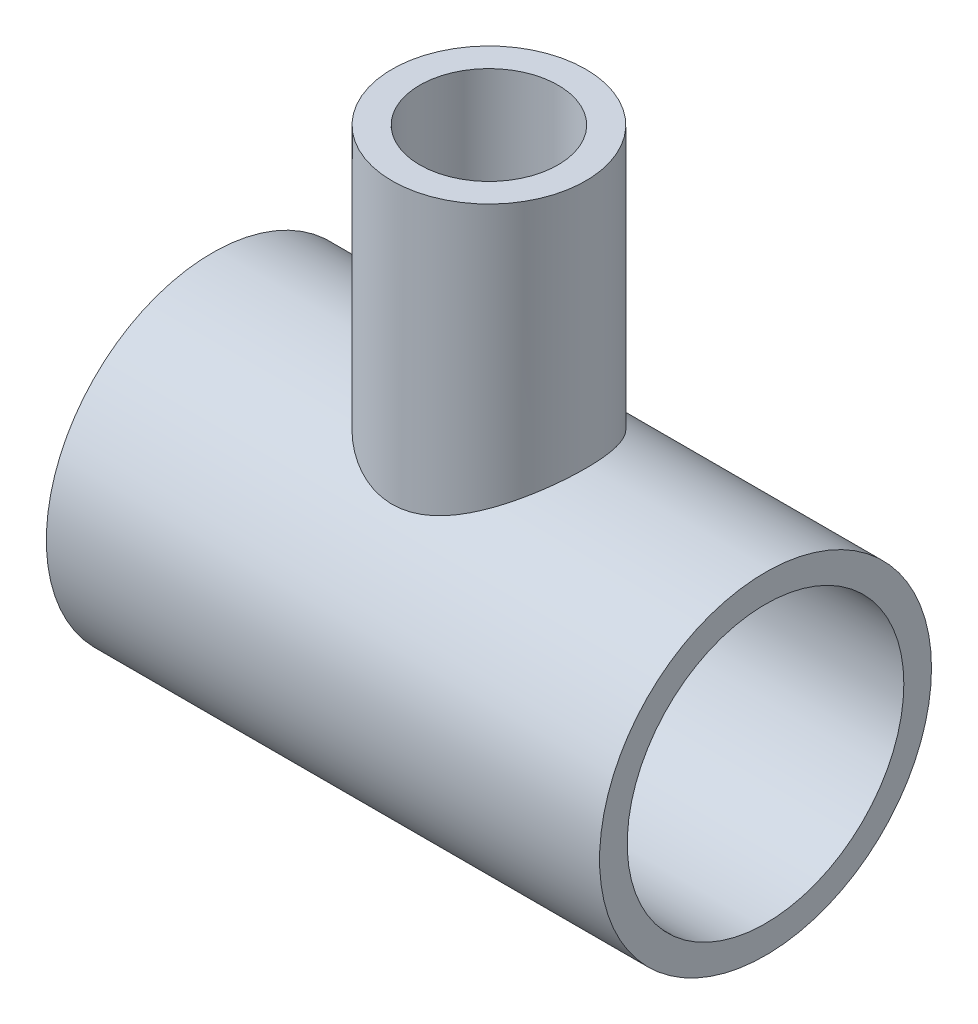
ISO-10303-21;
HEADER;
FILE_DESCRIPTION(('STEP AP214'),'2;1');
FILE_NAME('part.step','',(''),(''),'','','');
FILE_SCHEMA(('AUTOMOTIVE_DESIGN { 1 0 10303 214 1 1 1 1 }'));
ENDSEC;
DATA;
#1=APPLICATION_CONTEXT('core data for automotive mechanical design processes');
#2=APPLICATION_PROTOCOL_DEFINITION('international standard','automotive_design',2000,#1);
#3=PRODUCT_CONTEXT('',#1,'mechanical');
#4=PRODUCT('Part','Part','',(#3));
#5=PRODUCT_RELATED_PRODUCT_CATEGORY('part','',(#4));
#6=PRODUCT_DEFINITION_FORMATION('','',#4);
#7=PRODUCT_DEFINITION_CONTEXT('part definition',#1,'design');
#8=PRODUCT_DEFINITION('design','',#6,#7);
#9=PRODUCT_DEFINITION_SHAPE('','',#8);
#10=(LENGTH_UNIT() NAMED_UNIT(*) SI_UNIT(.MILLI.,.METRE.));
#11=(NAMED_UNIT(*) PLANE_ANGLE_UNIT() SI_UNIT($,.RADIAN.));
#12=(NAMED_UNIT(*) SI_UNIT($,.STERADIAN.) SOLID_ANGLE_UNIT());
#13=UNCERTAINTY_MEASURE_WITH_UNIT(LENGTH_MEASURE(1.E-05),#10,'distance_accuracy_value','');
#14=(GEOMETRIC_REPRESENTATION_CONTEXT(3) GLOBAL_UNCERTAINTY_ASSIGNED_CONTEXT((#13)) GLOBAL_UNIT_ASSIGNED_CONTEXT((#10,
#11,#12)) REPRESENTATION_CONTEXT('',''));
#15=CARTESIAN_POINT('',(0.,0.,0.));
#16=DIRECTION('',(0.,0.,1.));
#17=DIRECTION('',(1.,0.,0.));
#18=AXIS2_PLACEMENT_3D('',#15,#16,#17);
#19=CARTESIAN_POINT('',(25.4,0.,0.));
#20=DIRECTION('',(-1.,0.,0.));
#21=DIRECTION('',(0.,0.,1.));
#22=AXIS2_PLACEMENT_3D('',#19,#20,#21);
#23=CYLINDRICAL_SURFACE('',#22,7.62);
#24=CARTESIAN_POINT('',(25.4,0.,0.));
#25=DIRECTION('',(1.,0.,0.));
#26=DIRECTION('',(0.,0.,-1.));
#27=AXIS2_PLACEMENT_3D('',#24,#25,#26);
#28=CIRCLE('',#27,7.62);
#29=CARTESIAN_POINT('',(25.4,0.,-7.62));
#30=VERTEX_POINT('',#29);
#31=EDGE_CURVE('E47',#30,#30,#28,.T.);
#32=ORIENTED_EDGE('',*,*,#31,.F.);
#33=EDGE_LOOP('',(#32));
#34=FACE_BOUND('',#33,.T.);
#35=CARTESIAN_POINT('',(0.,0.,0.));
#36=DIRECTION('',(1.,0.,0.));
#37=DIRECTION('',(0.,0.,-1.));
#38=AXIS2_PLACEMENT_3D('',#35,#36,#37);
#39=CIRCLE('',#38,7.62);
#40=CARTESIAN_POINT('',(0.,0.,-7.62));
#41=VERTEX_POINT('',#40);
#42=EDGE_CURVE('E51',#41,#41,#39,.T.);
#43=ORIENTED_EDGE('',*,*,#42,.T.);
#44=EDGE_LOOP('',(#43));
#45=FACE_BOUND('',#44,.T.);
#46=CARTESIAN_POINT('',(12.7,6.18921440895369,-4.445));
#47=CARTESIAN_POINT('',(12.5874252404315,6.18921443900073,-4.4449999597885));
#48=CARTESIAN_POINT('',(12.4748503840668,6.19229731171013,-4.44071678496406));
#49=CARTESIAN_POINT('',(12.2506804280824,6.20449294589178,-4.42366087591703));
#50=CARTESIAN_POINT('',(12.1390853413135,6.21360578633453,-4.41088803051082));
#51=CARTESIAN_POINT('',(11.9177005687525,6.23748750251618,-4.37705119950536));
#52=CARTESIAN_POINT('',(11.8079121342478,6.25226013937609,-4.35598170024721));
#53=CARTESIAN_POINT('',(11.5909689997921,6.28687765790946,-4.30586702285576));
#54=CARTESIAN_POINT('',(11.4838155541007,6.30672490576864,-4.27681812362303));
#55=CARTESIAN_POINT('',(11.1688503144502,6.37251473161153,-4.17871428494979));
#56=CARTESIAN_POINT('',(10.9657711093086,6.42491455239088,-4.09842460161001));
#57=CARTESIAN_POINT('',(10.5761898261684,6.54080815429309,-3.91079724939134));
#58=CARTESIAN_POINT('',(10.3896930813853,6.60430548524112,-3.80345092087288));
#59=CARTESIAN_POINT('',(10.014909762034,6.74407033873023,-3.5503718205956));
#60=CARTESIAN_POINT('',(9.82887818995414,6.8209669293692,-3.40164612773528));
#61=CARTESIAN_POINT('',(9.48248216198191,6.97385212476122,-3.07605154919206));
#62=CARTESIAN_POINT('',(9.32213546516248,7.04984006795057,-2.89916335841487));
#63=CARTESIAN_POINT('',(9.09620938877857,7.1616239935867,-2.60538927562674));
#64=CARTESIAN_POINT('',(9.02041758629407,7.20014005762703,-2.49724737188918));
#65=CARTESIAN_POINT('',(8.87832116375021,7.27378202129827,-2.27383004030716));
#66=CARTESIAN_POINT('',(8.81201263016038,7.3089093174379,-2.15855758337805));
#67=CARTESIAN_POINT('',(8.68959481167879,7.37475865064844,-1.9215766064039));
#68=CARTESIAN_POINT('',(8.63348134815571,7.40548249145885,-1.79987074972725));
#69=CARTESIAN_POINT('',(8.53214341431144,7.46160987904796,-1.55082536456918));
#70=CARTESIAN_POINT('',(8.48691727387331,7.48701424175744,-1.4234867037129));
#71=CARTESIAN_POINT('',(8.41163684072027,7.52964560493014,-1.17606522599216));
#72=CARTESIAN_POINT('',(8.3805745844865,7.54740731534599,-1.05638086249932));
#73=CARTESIAN_POINT('',(8.32844636537536,7.57736100851875,-0.814176046986888));
#74=CARTESIAN_POINT('',(8.30737900235983,7.58955377139473,-0.691655994729223));
#75=CARTESIAN_POINT('',(8.27557572700312,7.60800482595106,-0.444923394578055));
#76=CARTESIAN_POINT('',(8.26483271281094,7.61426719695032,-0.320712069799445));
#77=CARTESIAN_POINT('',(8.25383101496697,7.62068058702623,-0.0716729712798327));
#78=CARTESIAN_POINT('',(8.25357134948088,7.62083217841743,0.0531547436370194));
#79=CARTESIAN_POINT('',(8.262948233017,7.6153656192976,0.287564519684153));
#80=CARTESIAN_POINT('',(8.27142323715585,7.61042467589027,0.397211205401915));
#81=CARTESIAN_POINT('',(8.29642474133349,7.5959032612223,0.615305792019325));
#82=CARTESIAN_POINT('',(8.31295369829738,7.58632137420866,0.72375331677398));
#83=CARTESIAN_POINT('',(8.35385805227751,7.56274054401281,0.938631417670741));
#84=CARTESIAN_POINT('',(8.37823077734691,7.54874310500204,1.04506266759439));
#85=CARTESIAN_POINT('',(8.43454077315983,7.51664744582814,1.25528677776906));
#86=CARTESIAN_POINT('',(8.46648097126534,7.49854763884406,1.35907859974922));
#87=CARTESIAN_POINT('',(8.57369629137912,7.43835949092514,1.66704160599411));
#88=CARTESIAN_POINT('',(8.66008766863966,7.39054777451179,1.86635838526446));
#89=CARTESIAN_POINT('',(8.85921588910782,7.28360897908787,2.24785158255045));
#90=CARTESIAN_POINT('',(8.97196012377061,7.22447872629585,2.43002317153491));
#91=CARTESIAN_POINT('',(9.23541274592914,7.09191838135626,2.7948033501708));
#92=CARTESIAN_POINT('',(9.38900545992574,7.01762528642277,2.97501991028058));
#93=CARTESIAN_POINT('',(9.7222564776275,6.86667254490882,3.30859958419451));
#94=CARTESIAN_POINT('',(9.90194797052178,6.7900099843471,3.46192794851842));
#95=CARTESIAN_POINT('',(10.3052895554796,6.63347499171945,3.75388254453167));
#96=CARTESIAN_POINT('',(10.5315820702463,6.55412779952593,3.88921270423196));
#97=CARTESIAN_POINT('',(10.8890837747738,6.447703120652,4.06154102999338));
#98=CARTESIAN_POINT('',(11.01123152544,6.41433376643916,4.11386419750578));
#99=CARTESIAN_POINT('',(11.2609244750951,6.35316043175631,4.20771569549603));
#100=CARTESIAN_POINT('',(11.3884676679044,6.32535440433818,4.24924799800709));
#101=CARTESIAN_POINT('',(11.7163327154582,6.26389017597833,4.33964586123727));
#102=CARTESIAN_POINT('',(11.91971651377,6.23482085623455,4.38091833679286));
#103=CARTESIAN_POINT('',(12.3319343478016,6.19676011987447,4.43460174640953));
#104=CARTESIAN_POINT('',(12.5407624861959,6.18774782267167,4.4470426964093));
#105=CARTESIAN_POINT('',(12.9581111631146,6.19107586833303,4.44240745646092));
#106=CARTESIAN_POINT('',(13.1666312599597,6.20343530082334,4.42530487769763));
#107=CARTESIAN_POINT('',(13.577221716732,6.24772691909617,4.36253668241333));
#108=CARTESIAN_POINT('',(13.7792870807078,6.2796738970525,4.31684947874702));
#109=CARTESIAN_POINT('',(14.173674148509,6.35927810192452,4.19869465082771));
#110=CARTESIAN_POINT('',(14.3659147237686,6.40704738765491,4.12603554622402));
#111=CARTESIAN_POINT('',(14.736189724577,6.51313362261511,3.95644691210603));
#112=CARTESIAN_POINT('',(14.9142184994081,6.57145473752193,3.85950779143731));
#113=CARTESIAN_POINT('',(15.2834762620826,6.70418514096109,3.62483841687019));
#114=CARTESIAN_POINT('',(15.4716924915698,6.77963486241225,3.48295740955966));
#115=CARTESIAN_POINT('',(15.823566009276,6.9309294135684,3.17121625585786));
#116=CARTESIAN_POINT('',(15.9872013175392,7.00677453487736,3.00133135003058));
#117=CARTESIAN_POINT('',(16.2201214309406,7.11985707227413,2.71735637615737));
#118=CARTESIAN_POINT('',(16.2990691454363,7.15930126139773,2.61192838585634));
#119=CARTESIAN_POINT('',(16.447722937242,7.23517177208537,2.39374300820208));
#120=CARTESIAN_POINT('',(16.5174325988071,7.27159926202311,2.28098848891023));
#121=CARTESIAN_POINT('',(16.6469195296373,7.34040484310881,2.04878471887388));
#122=CARTESIAN_POINT('',(16.7066999964387,7.3727842370466,1.92933763999574));
#123=CARTESIAN_POINT('',(16.8156357115218,7.43254714571208,1.68449172088176));
#124=CARTESIAN_POINT('',(16.8647924317933,7.45993135247362,1.55909370812704));
#125=CARTESIAN_POINT('',(16.9483689745394,7.50692458470601,1.31334897435093));
#126=CARTESIAN_POINT('',(16.9836419004629,7.52697480400424,1.19337673952187));
#127=CARTESIAN_POINT('',(17.0440724394082,7.56152925475313,0.950135628359151));
#128=CARTESIAN_POINT('',(17.0692315297687,7.57603429617862,0.826867236306236));
#129=CARTESIAN_POINT('',(17.1090328096031,7.59905795516163,0.578186217074514));
#130=CARTESIAN_POINT('',(17.1236830593659,7.60758116068332,0.452775308962574));
#131=CARTESIAN_POINT('',(17.1422523112143,7.61839368481031,0.200898926232637));
#132=CARTESIAN_POINT('',(17.1461724961385,7.62068369053796,0.0744335693945401));
#133=CARTESIAN_POINT('',(17.1434033651933,7.6190688698431,-0.162661822296677));
#134=CARTESIAN_POINT('',(17.1379674045474,7.61589585520631,-0.273314036006774));
#135=CARTESIAN_POINT('',(17.1188823219272,7.60479030137797,-0.493701559425868));
#136=CARTESIAN_POINT('',(17.1052306966187,7.59685631150706,-0.603436579326516));
#137=CARTESIAN_POINT('',(17.0698879880362,7.57641650395698,-0.821130750051012));
#138=CARTESIAN_POINT('',(17.0481998758766,7.56391237589555,-0.929090541796498));
#139=CARTESIAN_POINT('',(16.997047774611,7.5346242069609,-1.14257378347583));
#140=CARTESIAN_POINT('',(16.9675807818808,7.51783851295064,-1.24809627515322));
#141=CARTESIAN_POINT('',(16.8683439357358,7.46179900733622,-1.55882613410847));
#142=CARTESIAN_POINT('',(16.7875085372335,7.4167257727803,-1.75957985841132));
#143=CARTESIAN_POINT('',(16.5992585607675,7.31466753175382,-2.14473203771219));
#144=CARTESIAN_POINT('',(16.4918373185594,7.25767953918073,-2.32912637615303));
#145=CARTESIAN_POINT('',(16.2401722311735,7.1292496170642,-2.6982264474659));
#146=CARTESIAN_POINT('',(16.0931800797979,7.05690765678989,-2.88074251871784));
#147=CARTESIAN_POINT('',(15.7730834633382,6.90869523881854,-3.22003906137778));
#148=CARTESIAN_POINT('',(15.5999482629646,6.83282070161784,-3.37678878122018));
#149=CARTESIAN_POINT('',(15.3123756385631,6.71729277074043,-3.59867011920307));
#150=CARTESIAN_POINT('',(15.2058632361969,6.67646752077317,-3.67365125217314));
#151=CARTESIAN_POINT('',(14.9859970729781,6.59709361493654,-3.81435080271669));
#152=CARTESIAN_POINT('',(14.8726416017106,6.55854553304548,-3.88006689070102));
#153=CARTESIAN_POINT('',(14.6397246619529,6.4851140866454,-4.00159180020675));
#154=CARTESIAN_POINT('',(14.5201682310863,6.45022781487619,-4.05740850591032));
#155=CARTESIAN_POINT('',(14.2754545233236,6.38549397494766,-4.158542208046));
#156=CARTESIAN_POINT('',(14.1503014196779,6.35564272905929,-4.20386687725742));
#157=CARTESIAN_POINT('',(13.9171280236818,6.30690919823978,-4.27654858141131));
#158=CARTESIAN_POINT('',(13.8098608632996,6.28702344058996,-4.30565492977784));
#159=CARTESIAN_POINT('',(13.5927094983409,6.25234608289377,-4.35585833039437));
#160=CARTESIAN_POINT('',(13.4828268214498,6.23755158356655,-4.37695994174507));
#161=CARTESIAN_POINT('',(13.2612766123734,6.21363767784212,-4.41084330893043));
#162=CARTESIAN_POINT('',(13.1496108750731,6.20451289316594,-4.42363295001284));
#163=CARTESIAN_POINT('',(12.9252967941035,6.19230122856022,-4.44071133696577));
#164=CARTESIAN_POINT('',(12.8126484455133,6.18921437888699,-4.44500004023782));
#165=CARTESIAN_POINT('',(12.7,6.18921440895369,-4.445));
#166=B_SPLINE_CURVE_WITH_KNOTS('',3,(#46,#47,#48,#49,#50,#51,#52,#53,#54,#55,#56,#57,#58,#59,
#60,#61,#62,#63,#64,#65,#66,#67,#68,#69,#70,#71,#72,#73,#74,#75,#76,#77,#78,#79,#80,#81,#82,#83,
#84,#85,#86,#87,#88,#89,#90,#91,#92,#93,#94,#95,#96,#97,#98,#99,#100,#101,#102,#103,#104,#105,
#106,#107,#108,#109,#110,#111,#112,#113,#114,#115,#116,#117,#118,#119,#120,#121,#122,#123,#124,
#125,#126,#127,#128,#129,#130,#131,#132,#133,#134,#135,#136,#137,#138,#139,#140,#141,#142,#143,
#144,#145,#146,#147,#148,#149,#150,#151,#152,#153,#154,#155,#156,#157,#158,#159,#160,#161,#162,
#163,#164,#165),.UNSPECIFIED.,.T.,.F.,(4,2,2,2,2,2,2,2,2,2,2,2,2,2,2,2,2,2,2,2,2,2,2,2,2,2,2,2,
2,2,2,2,2,2,2,2,2,2,2,2,2,2,2,2,2,2,2,2,2,2,2,2,2,2,2,2,2,2,2,4),(0.,0.337601963597298,
0.67520834863217,1.01303947445288,1.3510284120976,2.02168564408632,2.69255779706337,
3.44048901254443,4.18893515207916,4.60114593062985,5.01318610520748,5.42505701490145,
5.8368647032198,6.21108834977846,6.58525955759374,6.9591731981505,7.33305181916341,
7.66291133022225,7.9928715307191,8.32271945041387,8.65269517569795,9.31702860750619,
9.98154859576728,10.7230164780365,11.4654356596941,12.2867845524082,12.6972714469504,
13.107607029718,13.7333202017739,14.3583816628491,14.9840017288796,15.6100948352257,
16.2407204941617,16.8715956584412,17.6111963327495,18.3514544617202,18.7634701848624,
19.1753255798265,19.5870480851943,19.998713507081,20.3781116567291,20.7574543671317,
21.1365058093668,21.5155154648351,21.8476044522279,22.1797946792639,22.5118622168607,
22.8440581622196,23.5042717535567,24.16465100783,24.8975528407277,25.6313231226993,
26.0404168742212,26.4496133049179,26.8584823606319,27.2670514609245,27.6053869518244,
27.9435294532711,28.2813507018124,28.6191736431827),.UNSPECIFIED.);
#167=CARTESIAN_POINT('',(12.7,6.18921440895369,-4.445));
#168=VERTEX_POINT('',#167);
#169=EDGE_CURVE('E10',#168,#168,#166,.T.);
#170=ORIENTED_EDGE('',*,*,#169,.F.);
#171=EDGE_LOOP('',(#170));
#172=FACE_BOUND('',#171,.T.);
#173=ADVANCED_FACE('F36',(#34,#45,#172),#23,.T.);
#174=CARTESIAN_POINT('',(25.4,0.,0.));
#175=DIRECTION('',(1.,0.,0.));
#176=DIRECTION('',(0.,0.,-1.));
#177=AXIS2_PLACEMENT_3D('',#174,#175,#176);
#178=PLANE('',#177);
#179=CARTESIAN_POINT('',(25.4,0.,0.));
#180=DIRECTION('',(1.,0.,0.));
#181=DIRECTION('',(0.,0.,-1.));
#182=AXIS2_PLACEMENT_3D('',#179,#180,#181);
#183=CIRCLE('',#182,6.35);
#184=CARTESIAN_POINT('',(25.4,0.,-6.35));
#185=VERTEX_POINT('',#184);
#186=EDGE_CURVE('E61',#185,#185,#183,.T.);
#187=ORIENTED_EDGE('',*,*,#186,.F.);
#188=EDGE_LOOP('',(#187));
#189=FACE_BOUND('',#188,.T.);
#190=ORIENTED_EDGE('',*,*,#31,.T.);
#191=EDGE_LOOP('',(#190));
#192=FACE_BOUND('',#191,.T.);
#193=ADVANCED_FACE('F95',(#189,#192),#178,.T.);
#194=CARTESIAN_POINT('',(0.,0.,0.));
#195=DIRECTION('',(1.,0.,0.));
#196=DIRECTION('',(0.,0.,-1.));
#197=AXIS2_PLACEMENT_3D('',#194,#195,#196);
#198=PLANE('',#197);
#199=CARTESIAN_POINT('',(0.,0.,0.));
#200=DIRECTION('',(1.,0.,0.));
#201=DIRECTION('',(0.,0.,-1.));
#202=AXIS2_PLACEMENT_3D('',#199,#200,#201);
#203=CIRCLE('',#202,6.35);
#204=CARTESIAN_POINT('',(0.,0.,-6.35));
#205=VERTEX_POINT('',#204);
#206=EDGE_CURVE('E60',#205,#205,#203,.T.);
#207=ORIENTED_EDGE('',*,*,#206,.T.);
#208=EDGE_LOOP('',(#207));
#209=FACE_BOUND('',#208,.T.);
#210=ORIENTED_EDGE('',*,*,#42,.F.);
#211=EDGE_LOOP('',(#210));
#212=FACE_BOUND('',#211,.T.);
#213=ADVANCED_FACE('F93',(#209,#212),#198,.F.);
#214=CARTESIAN_POINT('',(12.7,19.05,0.));
#215=DIRECTION('',(0.,-1.,0.));
#216=DIRECTION('',(0.,0.,-1.));
#217=AXIS2_PLACEMENT_3D('',#214,#215,#216);
#218=CYLINDRICAL_SURFACE('',#217,4.445);
#219=CARTESIAN_POINT('',(12.7,19.05,0.));
#220=DIRECTION('',(0.,1.,0.));
#221=DIRECTION('',(0.,0.,1.));
#222=AXIS2_PLACEMENT_3D('',#219,#220,#221);
#223=CIRCLE('',#222,4.445);
#224=CARTESIAN_POINT('',(12.7,19.05,4.445));
#225=VERTEX_POINT('',#224);
#226=EDGE_CURVE('E56',#225,#225,#223,.T.);
#227=ORIENTED_EDGE('',*,*,#226,.F.);
#228=EDGE_LOOP('',(#227));
#229=FACE_BOUND('',#228,.T.);
#230=ORIENTED_EDGE('',*,*,#169,.T.);
#231=EDGE_LOOP('',(#230));
#232=FACE_BOUND('',#231,.T.);
#233=ADVANCED_FACE('F88',(#229,#232),#218,.T.);
#234=CARTESIAN_POINT('',(12.7,19.05,0.));
#235=DIRECTION('',(0.,1.,0.));
#236=DIRECTION('',(0.,0.,1.));
#237=AXIS2_PLACEMENT_3D('',#234,#235,#236);
#238=PLANE('',#237);
#239=CARTESIAN_POINT('',(12.7,19.05,0.));
#240=DIRECTION('',(0.,1.,0.));
#241=DIRECTION('',(0.,0.,1.));
#242=AXIS2_PLACEMENT_3D('',#239,#240,#241);
#243=CIRCLE('',#242,3.175);
#244=CARTESIAN_POINT('',(12.7,19.05,3.175));
#245=VERTEX_POINT('',#244);
#246=EDGE_CURVE('E64',#245,#245,#243,.T.);
#247=ORIENTED_EDGE('',*,*,#246,.F.);
#248=EDGE_LOOP('',(#247));
#249=FACE_BOUND('',#248,.T.);
#250=ORIENTED_EDGE('',*,*,#226,.T.);
#251=EDGE_LOOP('',(#250));
#252=FACE_BOUND('',#251,.T.);
#253=ADVANCED_FACE('F85',(#249,#252),#238,.T.);
#254=CARTESIAN_POINT('',(0.,0.,0.));
#255=DIRECTION('',(1.,0.,0.));
#256=DIRECTION('',(0.,0.,-1.));
#257=AXIS2_PLACEMENT_3D('',#254,#255,#256);
#258=CYLINDRICAL_SURFACE('',#257,6.35);
#259=CARTESIAN_POINT('',(12.7,5.49926131403118,3.175));
#260=CARTESIAN_POINT('',(12.6172380864675,5.49926232876913,3.17499905676822));
#261=CARTESIAN_POINT('',(12.5344660849583,5.50113815093942,3.1717573852825));
#262=CARTESIAN_POINT('',(12.3695797871413,5.50856077670455,3.15884523354689));
#263=CARTESIAN_POINT('',(12.2874658150492,5.51410928932437,3.1491717603564));
#264=CARTESIAN_POINT('',(12.0428342515892,5.53601678924102,3.11062065473092));
#265=CARTESIAN_POINT('',(11.882171953019,5.55763722742636,3.07221261154103));
#266=CARTESIAN_POINT('',(11.5714021878542,5.61178865498313,2.97211747978078));
#267=CARTESIAN_POINT('',(11.4212435598136,5.6442615458663,2.9105541372517));
#268=CARTESIAN_POINT('',(11.1333885772,5.71635543890045,2.76627435445934));
#269=CARTESIAN_POINT('',(10.9956928973657,5.75597682772092,2.68355676984061));
#270=CARTESIAN_POINT('',(10.7241761786603,5.84190034267495,2.49131627779835));
#271=CARTESIAN_POINT('',(10.5916114027183,5.88848395338309,2.38014521787043));
#272=CARTESIAN_POINT('',(10.3460292087452,5.98081052060146,2.13758083606043));
#273=CARTESIAN_POINT('',(10.233021541095,6.02655304768282,2.00617748851801));
#274=CARTESIAN_POINT('',(10.0223090471499,6.11573187346572,1.71605436473863));
#275=CARTESIAN_POINT('',(9.92614922106035,6.15880487346127,1.55609032527602));
#276=CARTESIAN_POINT('',(9.76267785688862,6.23413651147239,1.21969855929244));
#277=CARTESIAN_POINT('',(9.69534811281404,6.26640197156108,1.04328130884119));
#278=CARTESIAN_POINT('',(9.59642268546146,6.31445464313237,0.692292696730404));
#279=CARTESIAN_POINT('',(9.56262525320581,6.33125099630315,0.518483183758179));
#280=CARTESIAN_POINT('',(9.52447257382175,6.35024078782237,0.166911747158855));
#281=CARTESIAN_POINT('',(9.52009951224336,6.35244306187831,-0.0108477196166791));
#282=CARTESIAN_POINT('',(9.54007070120517,6.34247467450733,-0.348718268640213));
#283=CARTESIAN_POINT('',(9.56195074321593,6.33153724004097,-0.509019820270689));
#284=CARTESIAN_POINT('',(9.62939663545795,6.29838229153245,-0.82332121295533));
#285=CARTESIAN_POINT('',(9.67496425808659,6.27616393341038,-0.977320581525265));
#286=CARTESIAN_POINT('',(9.7887873140228,6.22209775234818,-1.27733236684466));
#287=CARTESIAN_POINT('',(9.85734792052068,6.19012095460315,-1.42320480220676));
#288=CARTESIAN_POINT('',(10.0147857200159,6.11942032404916,-1.70172616219331));
#289=CARTESIAN_POINT('',(10.1036701866477,6.08069407688628,-1.83437032813194));
#290=CARTESIAN_POINT('',(10.308895301586,5.99580926070808,-2.09605211974367));
#291=CARTESIAN_POINT('',(10.4270370904291,5.94929416927823,-2.22356359612797));
#292=CARTESIAN_POINT('',(10.6825623935202,5.85642633307518,-2.45777846555886));
#293=CARTESIAN_POINT('',(10.8199605735396,5.81007373990265,-2.56446584928023));
#294=CARTESIAN_POINT('',(11.1209477683689,5.71957289604347,-2.76069102698818));
#295=CARTESIAN_POINT('',(11.2856459110587,5.67575155752789,-2.84870951352547));
#296=CARTESIAN_POINT('',(11.5438375661308,5.61885247415839,-2.95849503046443));
#297=CARTESIAN_POINT('',(11.6317779285117,5.60135560040996,-2.99138760520285));
#298=CARTESIAN_POINT('',(11.8107974382114,5.56999217748627,-3.04938956554735));
#299=CARTESIAN_POINT('',(11.9018746113191,5.55612339050229,-3.07450375064138));
#300=CARTESIAN_POINT('',(12.0791516314038,5.53355357587716,-3.11492823782859));
#301=CARTESIAN_POINT('',(12.1651706421334,5.52453156228568,-3.13085491331031));
#302=CARTESIAN_POINT('',(12.3385106275881,5.51045313491466,-3.15556797554225));
#303=CARTESIAN_POINT('',(12.4258309011336,5.50539465890766,-3.16435807553686));
#304=CARTESIAN_POINT('',(12.6010151488662,5.49945626530651,-3.17466835867007));
#305=CARTESIAN_POINT('',(12.6888789083904,5.49857479177741,-3.17619124884848));
#306=CARTESIAN_POINT('',(12.8643448376426,5.50101508803298,-3.17195985852084));
#307=CARTESIAN_POINT('',(12.9519470246276,5.50433657410105,-3.16620606921981));
#308=CARTESIAN_POINT('',(13.1940925856452,5.51925588435845,-3.14018226453034));
#309=CARTESIAN_POINT('',(13.3476056075286,5.53528611699027,-3.11209439281024));
#310=CARTESIAN_POINT('',(13.6473468805934,5.57828096923593,-3.0343376295836));
#311=CARTESIAN_POINT('',(13.7935727555203,5.60524912972109,-2.98466174914483));
#312=CARTESIAN_POINT('',(14.0824226266486,5.66852625788959,-2.86273054239685));
#313=CARTESIAN_POINT('',(14.2245661320318,5.70520999770139,-2.78953600385261));
#314=CARTESIAN_POINT('',(14.4953671847707,5.7834564691364,-2.62346157669833));
#315=CARTESIAN_POINT('',(14.6240177534421,5.82502170218951,-2.53057157570877));
#316=CARTESIAN_POINT('',(14.8811568715187,5.91464405440152,-2.31405795861388));
#317=CARTESIAN_POINT('',(15.0075807617025,5.96285904289681,-2.18803622695199));
#318=CARTESIAN_POINT('',(15.2381340475204,6.0558119327906,-1.91580928554187));
#319=CARTESIAN_POINT('',(15.3422559123232,6.10054865642871,-1.76959728537411));
#320=CARTESIAN_POINT('',(15.5275715266821,6.18303824145362,-1.45584977269243));
#321=CARTESIAN_POINT('',(15.6080876368263,6.22057562531784,-1.28785333421913));
#322=CARTESIAN_POINT('',(15.7389128582287,6.28279651772886,-0.93828350831361));
#323=CARTESIAN_POINT('',(15.7892484938744,6.30749131056505,-0.756722200806245));
#324=CARTESIAN_POINT('',(15.8539451905403,6.33944338582815,-0.403160492410787));
#325=CARTESIAN_POINT('',(15.8711832643018,6.34809271326659,-0.231811338563334));
#326=CARTESIAN_POINT('',(15.8776773594255,6.35133763722966,0.111525009731682));
#327=CARTESIAN_POINT('',(15.8669431762855,6.3459381534549,0.283511959769309));
#328=CARTESIAN_POINT('',(15.819702940442,6.32250351776756,0.611308110350747));
#329=CARTESIAN_POINT('',(15.7849417201372,6.30532443151586,0.767436553820506));
#330=CARTESIAN_POINT('',(15.6929866606661,6.26084894800281,1.07139095342116));
#331=CARTESIAN_POINT('',(15.6357896045092,6.23355109988091,1.21921571544173));
#332=CARTESIAN_POINT('',(15.4980420621378,6.16984840144776,1.50946910032131));
#333=CARTESIAN_POINT('',(15.4165973718741,6.13310397734646,1.65139651176318));
#334=CARTESIAN_POINT('',(15.2337818456706,6.05434784579293,1.92016030444462));
#335=CARTESIAN_POINT('',(15.1324018577453,6.0123337223239,2.04698971133066));
#336=CARTESIAN_POINT('',(14.9009261687049,5.92228494250573,2.29524860659569));
#337=CARTESIAN_POINT('',(14.7689767688479,5.87406724075614,2.41488454123001));
#338=CARTESIAN_POINT('',(14.4860662694591,5.78049654064408,2.63101905620371));
#339=CARTESIAN_POINT('',(14.3350885287421,5.73514610261339,2.7274971667743));
#340=CARTESIAN_POINT('',(14.0943205187556,5.67271720109896,2.85396050304135));
#341=CARTESIAN_POINT('',(14.0102422772936,5.65257123598791,2.89354057606826));
#342=CARTESIAN_POINT('',(13.8383927754825,5.61522862075768,2.96535747654718));
#343=CARTESIAN_POINT('',(13.7506234451167,5.59803045260694,2.99759808643801));
#344=CARTESIAN_POINT('',(13.5722309915754,5.5673118679383,3.0542719435453));
#345=CARTESIAN_POINT('',(13.4816158831696,5.55378200380455,3.07872527562275));
#346=CARTESIAN_POINT('',(13.2981115214591,5.53094387019911,3.11956903021308));
#347=CARTESIAN_POINT('',(13.2052239060257,5.52163264949546,3.13596509002515));
#348=CARTESIAN_POINT('',(13.0435362512041,5.50956192150408,3.15710761797221));
#349=CARTESIAN_POINT('',(12.9750663272401,5.5057086840578,3.16381073091702));
#350=CARTESIAN_POINT('',(12.837733281387,5.50055787263126,3.17275746355017));
#351=CARTESIAN_POINT('',(12.7688701335028,5.49926046961937,3.17500078490813));
#352=CARTESIAN_POINT('',(12.7,5.49926131403118,3.175));
#353=B_SPLINE_CURVE_WITH_KNOTS('',3,(#259,#260,#261,#262,#263,#264,#265,#266,#267,#268,#269,
#270,#271,#272,#273,#274,#275,#276,#277,#278,#279,#280,#281,#282,#283,#284,#285,#286,#287,#288,
#289,#290,#291,#292,#293,#294,#295,#296,#297,#298,#299,#300,#301,#302,#303,#304,#305,#306,#307,
#308,#309,#310,#311,#312,#313,#314,#315,#316,#317,#318,#319,#320,#321,#322,#323,#324,#325,#326,
#327,#328,#329,#330,#331,#332,#333,#334,#335,#336,#337,#338,#339,#340,#341,#342,#343,#344,#345,
#346,#347,#348,#349,#350,#351,#352),.UNSPECIFIED.,.T.,.F.,(4,2,2,2,2,2,2,2,2,2,2,2,2,2,2,2,2,2,
2,2,2,2,2,2,2,2,2,2,2,2,2,2,2,2,2,2,2,2,2,2,2,2,2,2,2,2,4),(0.,0.248210314193369,
0.496536210172844,0.993616655653378,1.48807751301481,1.98256512428753,2.51783706318107,
3.05337510292796,3.62501229957992,4.19628797710272,4.72691486873112,5.25722047303095,
5.74141031613327,6.22563639342838,6.71656194871309,7.20766347537031,7.74518754975546,
8.2831232528071,8.85521994590917,9.14138502893469,9.42737318655796,9.69083660833536,
9.95416285897606,10.2173910127766,10.4806013985705,10.9489167635524,11.4173838546846,
11.9075481007329,12.3979646273261,12.9502005485241,13.5026226528976,14.0696241997013,
14.6361266987681,15.1506510247058,15.6649951955482,16.1454469295095,16.625967578846,
17.1270402751829,17.6283435455375,18.1795366185793,18.7312151251733,19.0161455987001,
19.3009288973909,19.5849716229022,19.8688153329579,20.075349152287,20.2818967868888),.UNSPECIFIED.);
#354=CARTESIAN_POINT('',(12.7,5.49926131403118,3.175));
#355=VERTEX_POINT('',#354);
#356=EDGE_CURVE('E69',#355,#355,#353,.T.);
#357=ORIENTED_EDGE('',*,*,#356,.F.);
#358=EDGE_LOOP('',(#357));
#359=FACE_BOUND('',#358,.T.);
#360=ORIENTED_EDGE('',*,*,#206,.F.);
#361=EDGE_LOOP('',(#360));
#362=FACE_BOUND('',#361,.T.);
#363=ORIENTED_EDGE('',*,*,#186,.T.);
#364=EDGE_LOOP('',(#363));
#365=FACE_BOUND('',#364,.T.);
#366=ADVANCED_FACE('F81',(#359,#362,#365),#258,.F.);
#367=CARTESIAN_POINT('',(12.7,-7.621,0.));
#368=DIRECTION('',(0.,1.,0.));
#369=DIRECTION('',(0.,0.,1.));
#370=AXIS2_PLACEMENT_3D('',#367,#368,#369);
#371=CYLINDRICAL_SURFACE('',#370,3.175);
#372=ORIENTED_EDGE('',*,*,#246,.T.);
#373=EDGE_LOOP('',(#372));
#374=FACE_BOUND('',#373,.T.);
#375=ORIENTED_EDGE('',*,*,#356,.T.);
#376=EDGE_LOOP('',(#375));
#377=FACE_BOUND('',#376,.T.);
#378=ADVANCED_FACE('F76',(#374,#377),#371,.F.);
#379=CLOSED_SHELL('',(#173,#193,#213,#233,#253,#366,#378));
#380=MANIFOLD_SOLID_BREP('B2',#379);
#381=ADVANCED_BREP_SHAPE_REPRESENTATION('',(#18,#380),#14);
#382=SHAPE_DEFINITION_REPRESENTATION(#9,#381);
ENDSEC;
END-ISO-10303-21;
